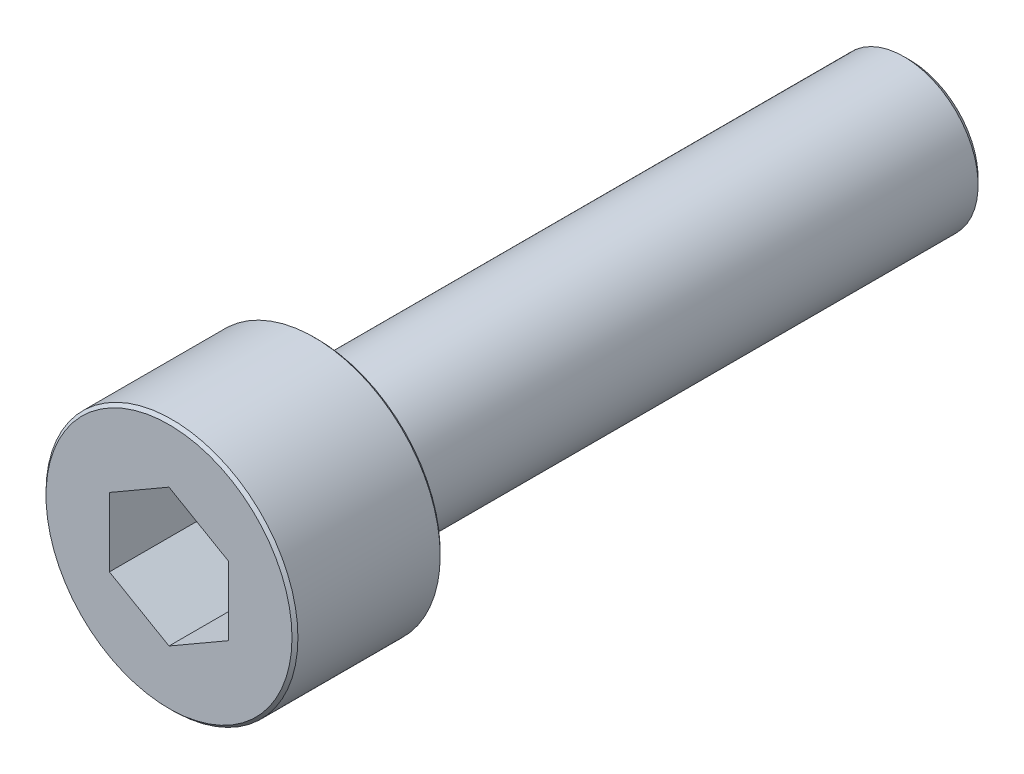
ISO-10303-21;
HEADER;
FILE_DESCRIPTION(('STEP AP214'),'2;1');
FILE_NAME('part.step','',(''),(''),'','','');
FILE_SCHEMA(('AUTOMOTIVE_DESIGN { 1 0 10303 214 1 1 1 1 }'));
ENDSEC;
DATA;
#1=APPLICATION_CONTEXT('core data for automotive mechanical design processes');
#2=APPLICATION_PROTOCOL_DEFINITION('international standard','automotive_design',2000,#1);
#3=PRODUCT_CONTEXT('',#1,'mechanical');
#4=PRODUCT('Part','Part','',(#3));
#5=PRODUCT_RELATED_PRODUCT_CATEGORY('part','',(#4));
#6=PRODUCT_DEFINITION_FORMATION('','',#4);
#7=PRODUCT_DEFINITION_CONTEXT('part definition',#1,'design');
#8=PRODUCT_DEFINITION('design','',#6,#7);
#9=PRODUCT_DEFINITION_SHAPE('','',#8);
#10=(LENGTH_UNIT() NAMED_UNIT(*) SI_UNIT(.MILLI.,.METRE.));
#11=(NAMED_UNIT(*) PLANE_ANGLE_UNIT() SI_UNIT($,.RADIAN.));
#12=(NAMED_UNIT(*) SI_UNIT($,.STERADIAN.) SOLID_ANGLE_UNIT());
#13=UNCERTAINTY_MEASURE_WITH_UNIT(LENGTH_MEASURE(1.E-05),#10,'distance_accuracy_value','');
#14=(GEOMETRIC_REPRESENTATION_CONTEXT(3) GLOBAL_UNCERTAINTY_ASSIGNED_CONTEXT((#13)) GLOBAL_UNIT_ASSIGNED_CONTEXT((#10,
#11,#12)) REPRESENTATION_CONTEXT('',''));
#15=CARTESIAN_POINT('',(0.,0.,0.));
#16=DIRECTION('',(0.,0.,1.));
#17=DIRECTION('',(1.,0.,0.));
#18=AXIS2_PLACEMENT_3D('',#15,#16,#17);
#19=CARTESIAN_POINT('',(0.,0.,20.));
#20=DIRECTION('',(0.,0.,1.));
#21=DIRECTION('',(1.,0.,0.));
#22=AXIS2_PLACEMENT_3D('',#19,#20,#21);
#23=CYLINDRICAL_SURFACE('',#22,4.25);
#24=CARTESIAN_POINT('',(0.,0.,20.1000017261313));
#25=DIRECTION('',(0.,0.,-1.));
#26=DIRECTION('',(-1.,0.,0.));
#27=AXIS2_PLACEMENT_3D('',#24,#25,#26);
#28=CIRCLE('',#27,4.25);
#29=CARTESIAN_POINT('',(-4.25,0.,20.1000017261313));
#30=VERTEX_POINT('',#29);
#31=EDGE_CURVE('E155',#30,#30,#28,.F.);
#32=ORIENTED_EDGE('',*,*,#31,.T.);
#33=EDGE_LOOP('',(#32));
#34=FACE_BOUND('',#33,.T.);
#35=CARTESIAN_POINT('',(0.,0.,24.8999982046334));
#36=DIRECTION('',(0.,0.,1.));
#37=DIRECTION('',(1.,0.,0.));
#38=AXIS2_PLACEMENT_3D('',#35,#36,#37);
#39=CIRCLE('',#38,4.25);
#40=CARTESIAN_POINT('',(4.25,0.,24.8999982046334));
#41=VERTEX_POINT('',#40);
#42=EDGE_CURVE('E152',#41,#41,#39,.F.);
#43=ORIENTED_EDGE('',*,*,#42,.T.);
#44=EDGE_LOOP('',(#43));
#45=FACE_BOUND('',#44,.T.);
#46=ADVANCED_FACE('F41',(#34,#45),#23,.T.);
#47=CARTESIAN_POINT('',(4.25,0.,20.));
#48=DIRECTION('',(0.,0.,-1.));
#49=DIRECTION('',(-1.,0.,0.));
#50=AXIS2_PLACEMENT_3D('',#47,#48,#49);
#51=PLANE('',#50);
#52=CARTESIAN_POINT('',(0.,0.,20.));
#53=DIRECTION('',(0.,0.,-1.));
#54=DIRECTION('',(-1.,0.,0.));
#55=AXIS2_PLACEMENT_3D('',#52,#53,#54);
#56=CIRCLE('',#55,4.14999820463339);
#57=CARTESIAN_POINT('',(-4.14999820463339,0.,20.));
#58=VERTEX_POINT('',#57);
#59=EDGE_CURVE('E158',#58,#58,#56,.T.);
#60=ORIENTED_EDGE('',*,*,#59,.T.);
#61=EDGE_LOOP('',(#60));
#62=FACE_BOUND('',#61,.T.);
#63=CARTESIAN_POINT('',(0.,0.,20.));
#64=DIRECTION('',(0.,0.,-1.));
#65=DIRECTION('',(-1.,0.,0.));
#66=AXIS2_PLACEMENT_3D('',#63,#64,#65);
#67=CIRCLE('',#66,2.5);
#68=CARTESIAN_POINT('',(-2.5,0.,20.));
#69=VERTEX_POINT('',#68);
#70=EDGE_CURVE('E144',#69,#69,#67,.T.);
#71=ORIENTED_EDGE('',*,*,#70,.F.);
#72=EDGE_LOOP('',(#71));
#73=FACE_BOUND('',#72,.T.);
#74=ADVANCED_FACE('F178',(#62,#73),#51,.T.);
#75=CARTESIAN_POINT('',(0.,0.,25.));
#76=DIRECTION('',(0.,0.,1.));
#77=DIRECTION('',(1.,0.,0.));
#78=AXIS2_PLACEMENT_3D('',#75,#76,#77);
#79=PLANE('',#78);
#80=CARTESIAN_POINT('',(0.,0.,25.));
#81=DIRECTION('',(0.,0.,1.));
#82=DIRECTION('',(1.,0.,0.));
#83=AXIS2_PLACEMENT_3D('',#80,#81,#82);
#84=CIRCLE('',#83,4.14999827386868);
#85=CARTESIAN_POINT('',(4.14999827386868,0.,25.));
#86=VERTEX_POINT('',#85);
#87=EDGE_CURVE('E161',#86,#86,#84,.T.);
#88=ORIENTED_EDGE('',*,*,#87,.T.);
#89=EDGE_LOOP('',(#88));
#90=FACE_BOUND('',#89,.T.);
#91=DIRECTION('',(0.,-1.,0.));
#92=VECTOR('',#91,1.);
#93=CARTESIAN_POINT('',(-2.00999999999998,1.16047404107096,25.));
#94=LINE('',#93,#92);
#95=CARTESIAN_POINT('',(-2.00999999999998,1.16047404107096,25.));
#96=VERTEX_POINT('',#95);
#97=CARTESIAN_POINT('',(-2.01,-1.160474041071,25.));
#98=VERTEX_POINT('',#97);
#99=EDGE_CURVE('E57',#96,#98,#94,.T.);
#100=ORIENTED_EDGE('',*,*,#99,.F.);
#101=DIRECTION('',(-0.866025403784436,-0.500000000000004,0.));
#102=VECTOR('',#101,1.);
#103=CARTESIAN_POINT('',(0.,2.32094808214212,25.));
#104=LINE('',#103,#102);
#105=CARTESIAN_POINT('',(0.,2.32094808214212,25.));
#106=VERTEX_POINT('',#105);
#107=EDGE_CURVE('E140',#106,#96,#104,.T.);
#108=ORIENTED_EDGE('',*,*,#107,.F.);
#109=DIRECTION('',(-0.866025403784428,0.500000000000018,0.));
#110=VECTOR('',#109,1.);
#111=CARTESIAN_POINT('',(2.0099999999999,1.16047404107098,25.));
#112=LINE('',#111,#110);
#113=CARTESIAN_POINT('',(2.0099999999999,1.16047404107098,25.));
#114=VERTEX_POINT('',#113);
#115=EDGE_CURVE('E138',#114,#106,#112,.T.);
#116=ORIENTED_EDGE('',*,*,#115,.F.);
#117=DIRECTION('',(0.,1.,0.));
#118=VECTOR('',#117,1.);
#119=CARTESIAN_POINT('',(2.0099999999999,-1.16047404107098,25.));
#120=LINE('',#119,#118);
#121=CARTESIAN_POINT('',(2.0099999999999,-1.16047404107098,25.));
#122=VERTEX_POINT('',#121);
#123=EDGE_CURVE('E105',#122,#114,#120,.T.);
#124=ORIENTED_EDGE('',*,*,#123,.F.);
#125=DIRECTION('',(0.866025403784439,0.5,0.));
#126=VECTOR('',#125,1.);
#127=CARTESIAN_POINT('',(0.,-2.32094808214211,25.));
#128=LINE('',#127,#126);
#129=CARTESIAN_POINT('',(0.,-2.32094808214211,25.));
#130=VERTEX_POINT('',#129);
#131=EDGE_CURVE('E134',#130,#122,#128,.T.);
#132=ORIENTED_EDGE('',*,*,#131,.F.);
#133=DIRECTION('',(0.866025403784439,-0.5,0.));
#134=VECTOR('',#133,1.);
#135=CARTESIAN_POINT('',(-2.01,-1.160474041071,25.));
#136=LINE('',#135,#134);
#137=EDGE_CURVE('E131',#98,#130,#136,.T.);
#138=ORIENTED_EDGE('',*,*,#137,.F.);
#139=EDGE_LOOP('',(#100,#108,#116,#124,#132,#138));
#140=FACE_BOUND('',#139,.T.);
#141=ADVANCED_FACE('F184',(#90,#140),#79,.T.);
#142=CARTESIAN_POINT('',(0.,0.,0.));
#143=DIRECTION('',(0.,0.,1.));
#144=DIRECTION('',(1.,0.,0.));
#145=AXIS2_PLACEMENT_3D('',#142,#143,#144);
#146=CYLINDRICAL_SURFACE('',#145,2.5);
#147=CARTESIAN_POINT('',(0.,0.,0.200018288470087));
#148=DIRECTION('',(0.,0.,-1.));
#149=DIRECTION('',(-1.,0.,0.));
#150=AXIS2_PLACEMENT_3D('',#147,#148,#149);
#151=CIRCLE('',#150,2.5);
#152=CARTESIAN_POINT('',(-2.5,0.,0.200018288470087));
#153=VERTEX_POINT('',#152);
#154=EDGE_CURVE('E11',#153,#153,#151,.F.);
#155=ORIENTED_EDGE('',*,*,#154,.T.);
#156=EDGE_LOOP('',(#155));
#157=FACE_BOUND('',#156,.T.);
#158=ORIENTED_EDGE('',*,*,#70,.T.);
#159=EDGE_LOOP('',(#158));
#160=FACE_BOUND('',#159,.T.);
#161=ADVANCED_FACE('F211',(#157,#160),#146,.T.);
#162=CARTESIAN_POINT('',(0.,0.,0.));
#163=DIRECTION('',(0.,0.,-1.));
#164=DIRECTION('',(-1.,0.,0.));
#165=AXIS2_PLACEMENT_3D('',#162,#163,#164);
#166=PLANE('',#165);
#167=CARTESIAN_POINT('',(0.,0.,0.));
#168=DIRECTION('',(0.,0.,-1.));
#169=DIRECTION('',(-1.,0.,0.));
#170=AXIS2_PLACEMENT_3D('',#167,#168,#169);
#171=CIRCLE('',#170,2.29998317473318);
#172=CARTESIAN_POINT('',(-2.29998317473318,0.,0.));
#173=VERTEX_POINT('',#172);
#174=EDGE_CURVE('E50',#173,#173,#171,.T.);
#175=ORIENTED_EDGE('',*,*,#174,.T.);
#176=EDGE_LOOP('',(#175));
#177=FACE_BOUND('',#176,.T.);
#178=ADVANCED_FACE('F166',(#177),#166,.T.);
#179=CARTESIAN_POINT('',(-2.00999999999998,1.16047404107096,21.25));
#180=DIRECTION('',(-1.,0.,0.));
#181=DIRECTION('',(0.,-1.,0.));
#182=AXIS2_PLACEMENT_3D('',#179,#180,#181);
#183=PLANE('',#182);
#184=ORIENTED_EDGE('',*,*,#99,.T.);
#185=DIRECTION('',(0.,0.,1.));
#186=VECTOR('',#185,1.);
#187=CARTESIAN_POINT('',(-2.01,-1.160474041071,21.25));
#188=LINE('',#187,#186);
#189=CARTESIAN_POINT('',(-2.01,-1.160474041071,21.25));
#190=VERTEX_POINT('',#189);
#191=EDGE_CURVE('E87',#190,#98,#188,.T.);
#192=ORIENTED_EDGE('',*,*,#191,.F.);
#193=DIRECTION('',(0.,-1.,0.));
#194=VECTOR('',#193,1.);
#195=CARTESIAN_POINT('',(-2.00999999999998,1.16047404107096,21.25));
#196=LINE('',#195,#194);
#197=CARTESIAN_POINT('',(-2.00999999999998,1.16047404107096,21.25));
#198=VERTEX_POINT('',#197);
#199=EDGE_CURVE('E142',#198,#190,#196,.T.);
#200=ORIENTED_EDGE('',*,*,#199,.F.);
#201=DIRECTION('',(0.,0.,1.));
#202=VECTOR('',#201,1.);
#203=CARTESIAN_POINT('',(-2.00999999999998,1.16047404107096,21.25));
#204=LINE('',#203,#202);
#205=EDGE_CURVE('E65',#198,#96,#204,.T.);
#206=ORIENTED_EDGE('',*,*,#205,.T.);
#207=EDGE_LOOP('',(#184,#192,#200,#206));
#208=FACE_BOUND('',#207,.T.);
#209=ADVANCED_FACE('F219',(#208),#183,.F.);
#210=CARTESIAN_POINT('',(0.,2.32094808214212,21.25));
#211=DIRECTION('',(-0.500000000000004,0.866025403784436,0.));
#212=DIRECTION('',(-0.866025403784436,-0.500000000000004,0.));
#213=AXIS2_PLACEMENT_3D('',#210,#211,#212);
#214=PLANE('',#213);
#215=ORIENTED_EDGE('',*,*,#107,.T.);
#216=ORIENTED_EDGE('',*,*,#205,.F.);
#217=DIRECTION('',(-0.866025403784436,-0.500000000000004,0.));
#218=VECTOR('',#217,1.);
#219=CARTESIAN_POINT('',(0.,2.32094808214212,21.25));
#220=LINE('',#219,#218);
#221=CARTESIAN_POINT('',(0.,2.32094808214212,21.25));
#222=VERTEX_POINT('',#221);
#223=EDGE_CURVE('E117',#222,#198,#220,.T.);
#224=ORIENTED_EDGE('',*,*,#223,.F.);
#225=DIRECTION('',(0.,0.,1.));
#226=VECTOR('',#225,1.);
#227=CARTESIAN_POINT('',(0.,2.32094808214212,21.25));
#228=LINE('',#227,#226);
#229=EDGE_CURVE('E109',#222,#106,#228,.T.);
#230=ORIENTED_EDGE('',*,*,#229,.T.);
#231=EDGE_LOOP('',(#215,#216,#224,#230));
#232=FACE_BOUND('',#231,.T.);
#233=ADVANCED_FACE('F225',(#232),#214,.F.);
#234=CARTESIAN_POINT('',(2.0099999999999,1.16047404107098,21.25));
#235=DIRECTION('',(0.500000000000018,0.866025403784428,0.));
#236=DIRECTION('',(-0.866025403784428,0.500000000000018,0.));
#237=AXIS2_PLACEMENT_3D('',#234,#235,#236);
#238=PLANE('',#237);
#239=ORIENTED_EDGE('',*,*,#115,.T.);
#240=ORIENTED_EDGE('',*,*,#229,.F.);
#241=DIRECTION('',(-0.866025403784428,0.500000000000018,0.));
#242=VECTOR('',#241,1.);
#243=CARTESIAN_POINT('',(2.0099999999999,1.16047404107098,21.25));
#244=LINE('',#243,#242);
#245=CARTESIAN_POINT('',(2.0099999999999,1.16047404107098,21.25));
#246=VERTEX_POINT('',#245);
#247=EDGE_CURVE('E113',#246,#222,#244,.T.);
#248=ORIENTED_EDGE('',*,*,#247,.F.);
#249=DIRECTION('',(0.,0.,1.));
#250=VECTOR('',#249,1.);
#251=CARTESIAN_POINT('',(2.0099999999999,1.16047404107098,21.25));
#252=LINE('',#251,#250);
#253=EDGE_CURVE('E98',#246,#114,#252,.T.);
#254=ORIENTED_EDGE('',*,*,#253,.T.);
#255=EDGE_LOOP('',(#239,#240,#248,#254));
#256=FACE_BOUND('',#255,.T.);
#257=ADVANCED_FACE('F114',(#256),#238,.F.);
#258=CARTESIAN_POINT('',(2.0099999999999,-1.16047404107098,21.25));
#259=DIRECTION('',(1.,0.,0.));
#260=DIRECTION('',(0.,0.,-1.));
#261=AXIS2_PLACEMENT_3D('',#258,#259,#260);
#262=PLANE('',#261);
#263=ORIENTED_EDGE('',*,*,#123,.T.);
#264=ORIENTED_EDGE('',*,*,#253,.F.);
#265=DIRECTION('',(0.,1.,0.));
#266=VECTOR('',#265,1.);
#267=CARTESIAN_POINT('',(2.0099999999999,-1.16047404107098,21.25));
#268=LINE('',#267,#266);
#269=CARTESIAN_POINT('',(2.0099999999999,-1.16047404107098,21.25));
#270=VERTEX_POINT('',#269);
#271=EDGE_CURVE('E102',#270,#246,#268,.T.);
#272=ORIENTED_EDGE('',*,*,#271,.F.);
#273=DIRECTION('',(0.,0.,1.));
#274=VECTOR('',#273,1.);
#275=CARTESIAN_POINT('',(2.0099999999999,-1.16047404107098,21.25));
#276=LINE('',#275,#274);
#277=EDGE_CURVE('E110',#270,#122,#276,.T.);
#278=ORIENTED_EDGE('',*,*,#277,.T.);
#279=EDGE_LOOP('',(#263,#264,#272,#278));
#280=FACE_BOUND('',#279,.T.);
#281=ADVANCED_FACE('F100',(#280),#262,.F.);
#282=CARTESIAN_POINT('',(0.,-2.32094808214211,21.25));
#283=DIRECTION('',(0.5,-0.866025403784438,0.));
#284=DIRECTION('',(0.866025403784439,0.5,0.));
#285=AXIS2_PLACEMENT_3D('',#282,#283,#284);
#286=PLANE('',#285);
#287=ORIENTED_EDGE('',*,*,#131,.T.);
#288=ORIENTED_EDGE('',*,*,#277,.F.);
#289=DIRECTION('',(0.866025403784439,0.5,0.));
#290=VECTOR('',#289,1.);
#291=CARTESIAN_POINT('',(0.,-2.32094808214211,21.25));
#292=LINE('',#291,#290);
#293=CARTESIAN_POINT('',(0.,-2.32094808214211,21.25));
#294=VERTEX_POINT('',#293);
#295=EDGE_CURVE('E123',#294,#270,#292,.T.);
#296=ORIENTED_EDGE('',*,*,#295,.F.);
#297=DIRECTION('',(0.,0.,1.));
#298=VECTOR('',#297,1.);
#299=CARTESIAN_POINT('',(0.,-2.32094808214211,21.25));
#300=LINE('',#299,#298);
#301=EDGE_CURVE('E147',#294,#130,#300,.T.);
#302=ORIENTED_EDGE('',*,*,#301,.T.);
#303=EDGE_LOOP('',(#287,#288,#296,#302));
#304=FACE_BOUND('',#303,.T.);
#305=ADVANCED_FACE('F228',(#304),#286,.F.);
#306=CARTESIAN_POINT('',(-2.01,-1.160474041071,21.25));
#307=DIRECTION('',(-0.5,-0.866025403784439,0.));
#308=DIRECTION('',(0.866025403784439,-0.5,0.));
#309=AXIS2_PLACEMENT_3D('',#306,#307,#308);
#310=PLANE('',#309);
#311=ORIENTED_EDGE('',*,*,#137,.T.);
#312=ORIENTED_EDGE('',*,*,#301,.F.);
#313=DIRECTION('',(0.866025403784439,-0.5,0.));
#314=VECTOR('',#313,1.);
#315=CARTESIAN_POINT('',(-2.01,-1.160474041071,21.25));
#316=LINE('',#315,#314);
#317=EDGE_CURVE('E125',#190,#294,#316,.T.);
#318=ORIENTED_EDGE('',*,*,#317,.F.);
#319=ORIENTED_EDGE('',*,*,#191,.T.);
#320=EDGE_LOOP('',(#311,#312,#318,#319));
#321=FACE_BOUND('',#320,.T.);
#322=ADVANCED_FACE('F203',(#321),#310,.F.);
#323=CARTESIAN_POINT('',(0.,0.,21.25));
#324=DIRECTION('',(0.,0.,1.));
#325=DIRECTION('',(1.,0.,0.));
#326=AXIS2_PLACEMENT_3D('',#323,#324,#325);
#327=PLANE('',#326);
#328=ORIENTED_EDGE('',*,*,#199,.T.);
#329=ORIENTED_EDGE('',*,*,#317,.T.);
#330=ORIENTED_EDGE('',*,*,#295,.T.);
#331=ORIENTED_EDGE('',*,*,#271,.T.);
#332=ORIENTED_EDGE('',*,*,#247,.T.);
#333=ORIENTED_EDGE('',*,*,#223,.T.);
#334=EDGE_LOOP('',(#328,#329,#330,#331,#332,#333));
#335=FACE_BOUND('',#334,.T.);
#336=ADVANCED_FACE('F120',(#335),#327,.T.);
#337=CARTESIAN_POINT('',(0.,0.,20.1000017261313));
#338=DIRECTION('',(0.,0.,1.));
#339=DIRECTION('',(1.,0.,0.));
#340=AXIS2_PLACEMENT_3D('',#337,#338,#339);
#341=CONICAL_SURFACE('',#340,4.25,0.785398509567774);
#342=ORIENTED_EDGE('',*,*,#59,.F.);
#343=EDGE_LOOP('',(#342));
#344=FACE_BOUND('',#343,.T.);
#345=ORIENTED_EDGE('',*,*,#31,.F.);
#346=EDGE_LOOP('',(#345));
#347=FACE_BOUND('',#346,.T.);
#348=ADVANCED_FACE('F174',(#344,#347),#341,.T.);
#349=CARTESIAN_POINT('',(0.,0.,25.));
#350=DIRECTION('',(0.,0.,-1.));
#351=DIRECTION('',(-1.,0.,0.));
#352=AXIS2_PLACEMENT_3D('',#349,#350,#351);
#353=CONICAL_SURFACE('',#352,4.14999827386868,0.78539781722714);
#354=ORIENTED_EDGE('',*,*,#42,.F.);
#355=EDGE_LOOP('',(#354));
#356=FACE_BOUND('',#355,.T.);
#357=ORIENTED_EDGE('',*,*,#87,.F.);
#358=EDGE_LOOP('',(#357));
#359=FACE_BOUND('',#358,.T.);
#360=ADVANCED_FACE('F169',(#356,#359),#353,.T.);
#361=CARTESIAN_POINT('',(0.,0.,0.));
#362=DIRECTION('',(0.,0.,1.));
#363=DIRECTION('',(1.,0.,0.));
#364=AXIS2_PLACEMENT_3D('',#361,#362,#363);
#365=CONICAL_SURFACE('',#364,2.29998317473318,0.785394505710356);
#366=ORIENTED_EDGE('',*,*,#154,.F.);
#367=EDGE_LOOP('',(#366));
#368=FACE_BOUND('',#367,.T.);
#369=ORIENTED_EDGE('',*,*,#174,.F.);
#370=EDGE_LOOP('',(#369));
#371=FACE_BOUND('',#370,.T.);
#372=ADVANCED_FACE('F44',(#368,#371),#365,.T.);
#373=CLOSED_SHELL('',(#46,#74,#141,#161,#178,#209,#233,#257,#281,#305,#322,#336,#348,#360,#372));
#374=MANIFOLD_SOLID_BREP('B2',#373);
#375=ADVANCED_BREP_SHAPE_REPRESENTATION('',(#18,#374),#14);
#376=SHAPE_DEFINITION_REPRESENTATION(#9,#375);
ENDSEC;
END-ISO-10303-21;
